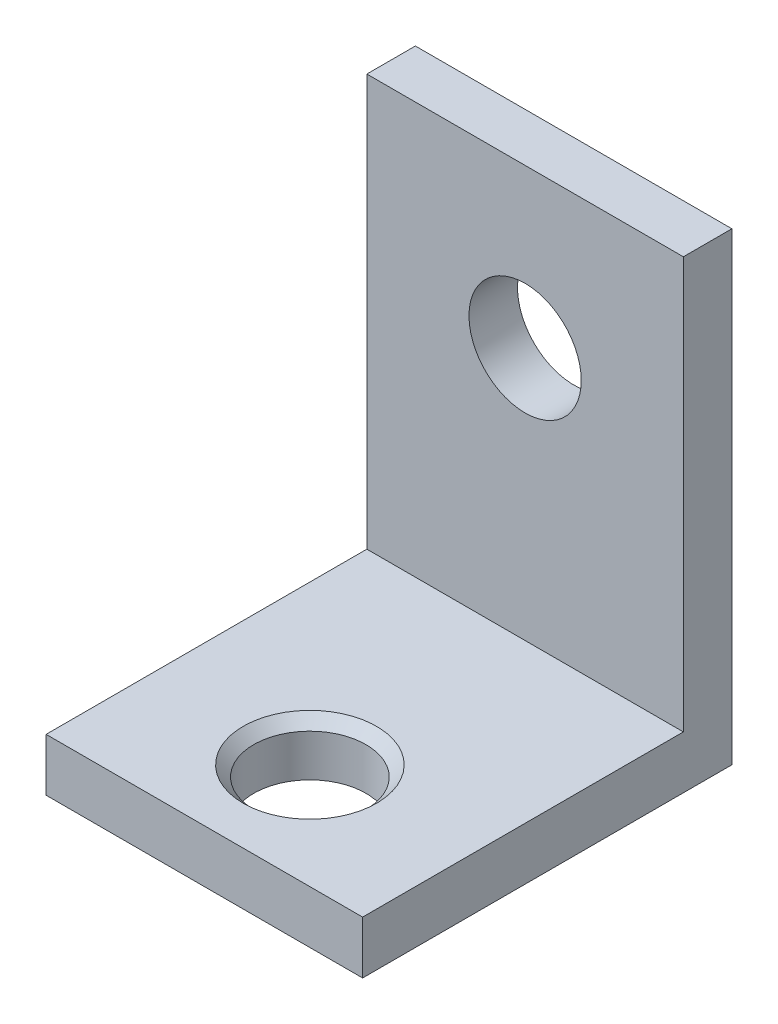
ISO-10303-21;
HEADER;
FILE_DESCRIPTION(('STEP AP214'),'2;1');
FILE_NAME('part.step','',(''),(''),'','','');
FILE_SCHEMA(('AUTOMOTIVE_DESIGN { 1 0 10303 214 1 1 1 1 }'));
ENDSEC;
DATA;
#1=APPLICATION_CONTEXT('core data for automotive mechanical design processes');
#2=APPLICATION_PROTOCOL_DEFINITION('international standard','automotive_design',2000,#1);
#3=PRODUCT_CONTEXT('',#1,'mechanical');
#4=PRODUCT('Part','Part','',(#3));
#5=PRODUCT_RELATED_PRODUCT_CATEGORY('part','',(#4));
#6=PRODUCT_DEFINITION_FORMATION('','',#4);
#7=PRODUCT_DEFINITION_CONTEXT('part definition',#1,'design');
#8=PRODUCT_DEFINITION('design','',#6,#7);
#9=PRODUCT_DEFINITION_SHAPE('','',#8);
#10=(LENGTH_UNIT() NAMED_UNIT(*) SI_UNIT(.MILLI.,.METRE.));
#11=(NAMED_UNIT(*) PLANE_ANGLE_UNIT() SI_UNIT($,.RADIAN.));
#12=(NAMED_UNIT(*) SI_UNIT($,.STERADIAN.) SOLID_ANGLE_UNIT());
#13=UNCERTAINTY_MEASURE_WITH_UNIT(LENGTH_MEASURE(1.E-05),#10,'distance_accuracy_value','');
#14=(GEOMETRIC_REPRESENTATION_CONTEXT(3) GLOBAL_UNCERTAINTY_ASSIGNED_CONTEXT((#13)) GLOBAL_UNIT_ASSIGNED_CONTEXT((#10,
#11,#12)) REPRESENTATION_CONTEXT('',''));
#15=CARTESIAN_POINT('',(0.,0.,0.));
#16=DIRECTION('',(0.,0.,1.));
#17=DIRECTION('',(1.,0.,0.));
#18=AXIS2_PLACEMENT_3D('',#15,#16,#17);
#19=CARTESIAN_POINT('',(0.,3.175,0.));
#20=DIRECTION('',(0.,-1.,0.));
#21=DIRECTION('',(0.,0.,-1.));
#22=AXIS2_PLACEMENT_3D('',#19,#20,#21);
#23=PLANE('',#22);
#24=CARTESIAN_POINT('',(9.525,3.175,-6.35));
#25=DIRECTION('',(0.,1.,0.));
#26=DIRECTION('',(0.,0.,1.));
#27=AXIS2_PLACEMENT_3D('',#24,#25,#26);
#28=CIRCLE('',#27,4.0132);
#29=CARTESIAN_POINT('',(9.525,3.175,-2.3368));
#30=VERTEX_POINT('',#29);
#31=EDGE_CURVE('E241',#30,#30,#28,.T.);
#32=ORIENTED_EDGE('',*,*,#31,.F.);
#33=EDGE_LOOP('',(#32));
#34=FACE_BOUND('',#33,.T.);
#35=DIRECTION('',(1.,0.,0.));
#36=VECTOR('',#35,1.);
#37=CARTESIAN_POINT('',(0.,3.175,-19.304));
#38=LINE('',#37,#36);
#39=CARTESIAN_POINT('',(0.,3.175,-19.304));
#40=VERTEX_POINT('',#39);
#41=CARTESIAN_POINT('',(19.05,3.175,-19.304));
#42=VERTEX_POINT('',#41);
#43=EDGE_CURVE('E56',#40,#42,#38,.T.);
#44=ORIENTED_EDGE('',*,*,#43,.F.);
#45=DIRECTION('',(0.,0.,1.));
#46=VECTOR('',#45,1.);
#47=CARTESIAN_POINT('',(0.,3.175,0.));
#48=LINE('',#47,#46);
#49=CARTESIAN_POINT('',(0.,3.175,0.));
#50=VERTEX_POINT('',#49);
#51=EDGE_CURVE('E107',#40,#50,#48,.T.);
#52=ORIENTED_EDGE('',*,*,#51,.T.);
#53=DIRECTION('',(1.,0.,0.));
#54=VECTOR('',#53,1.);
#55=CARTESIAN_POINT('',(0.,3.175,0.));
#56=LINE('',#55,#54);
#57=CARTESIAN_POINT('',(19.05,3.175,0.));
#58=VERTEX_POINT('',#57);
#59=EDGE_CURVE('E145',#50,#58,#56,.T.);
#60=ORIENTED_EDGE('',*,*,#59,.T.);
#61=DIRECTION('',(0.,0.,-1.));
#62=VECTOR('',#61,1.);
#63=CARTESIAN_POINT('',(19.05,3.175,0.));
#64=LINE('',#63,#62);
#65=EDGE_CURVE('E117',#58,#42,#64,.T.);
#66=ORIENTED_EDGE('',*,*,#65,.T.);
#67=EDGE_LOOP('',(#44,#52,#60,#66));
#68=FACE_BOUND('',#67,.T.);
#69=ADVANCED_FACE('F37',(#34,#68),#23,.F.);
#70=CARTESIAN_POINT('',(0.,3.175,0.));
#71=DIRECTION('',(1.,0.,0.));
#72=DIRECTION('',(0.,0.,-1.));
#73=AXIS2_PLACEMENT_3D('',#70,#71,#72);
#74=PLANE('',#73);
#75=DIRECTION('',(0.,0.,1.));
#76=VECTOR('',#75,1.);
#77=CARTESIAN_POINT('',(0.,0.,0.));
#78=LINE('',#77,#76);
#79=CARTESIAN_POINT('',(0.,0.,-22.225));
#80=VERTEX_POINT('',#79);
#81=CARTESIAN_POINT('',(0.,0.,0.));
#82=VERTEX_POINT('',#81);
#83=EDGE_CURVE('E114',#80,#82,#78,.T.);
#84=ORIENTED_EDGE('',*,*,#83,.T.);
#85=DIRECTION('',(0.,-1.,0.));
#86=VECTOR('',#85,1.);
#87=CARTESIAN_POINT('',(0.,3.175,0.));
#88=LINE('',#87,#86);
#89=EDGE_CURVE('E12',#50,#82,#88,.T.);
#90=ORIENTED_EDGE('',*,*,#89,.F.);
#91=ORIENTED_EDGE('',*,*,#51,.F.);
#92=DIRECTION('',(0.,-1.,0.));
#93=VECTOR('',#92,1.);
#94=CARTESIAN_POINT('',(0.,27.94,-19.304));
#95=LINE('',#94,#93);
#96=CARTESIAN_POINT('',(0.,27.94,-19.304));
#97=VERTEX_POINT('',#96);
#98=EDGE_CURVE('E121',#97,#40,#95,.T.);
#99=ORIENTED_EDGE('',*,*,#98,.F.);
#100=DIRECTION('',(0.,0.,1.));
#101=VECTOR('',#100,1.);
#102=CARTESIAN_POINT('',(0.,27.94,-22.225));
#103=LINE('',#102,#101);
#104=CARTESIAN_POINT('',(0.,27.94,-22.225));
#105=VERTEX_POINT('',#104);
#106=EDGE_CURVE('E116',#105,#97,#103,.T.);
#107=ORIENTED_EDGE('',*,*,#106,.F.);
#108=DIRECTION('',(0.,-1.,0.));
#109=VECTOR('',#108,1.);
#110=CARTESIAN_POINT('',(0.,3.175,-22.225));
#111=LINE('',#110,#109);
#112=EDGE_CURVE('E103',#105,#80,#111,.T.);
#113=ORIENTED_EDGE('',*,*,#112,.T.);
#114=EDGE_LOOP('',(#84,#90,#91,#99,#107,#113));
#115=FACE_BOUND('',#114,.T.);
#116=ADVANCED_FACE('F112',(#115),#74,.F.);
#117=CARTESIAN_POINT('',(0.,3.175,0.));
#118=DIRECTION('',(0.,0.,-1.));
#119=DIRECTION('',(-1.,0.,0.));
#120=AXIS2_PLACEMENT_3D('',#117,#118,#119);
#121=PLANE('',#120);
#122=DIRECTION('',(1.,0.,0.));
#123=VECTOR('',#122,1.);
#124=CARTESIAN_POINT('',(0.,0.,0.));
#125=LINE('',#124,#123);
#126=CARTESIAN_POINT('',(19.05,0.,0.));
#127=VERTEX_POINT('',#126);
#128=EDGE_CURVE('E120',#82,#127,#125,.T.);
#129=ORIENTED_EDGE('',*,*,#128,.T.);
#130=DIRECTION('',(0.,-1.,0.));
#131=VECTOR('',#130,1.);
#132=CARTESIAN_POINT('',(19.05,3.175,0.));
#133=LINE('',#132,#131);
#134=EDGE_CURVE('E47',#58,#127,#133,.T.);
#135=ORIENTED_EDGE('',*,*,#134,.F.);
#136=ORIENTED_EDGE('',*,*,#59,.F.);
#137=ORIENTED_EDGE('',*,*,#89,.T.);
#138=EDGE_LOOP('',(#129,#135,#136,#137));
#139=FACE_BOUND('',#138,.T.);
#140=ADVANCED_FACE('F170',(#139),#121,.F.);
#141=CARTESIAN_POINT('',(19.05,3.175,0.));
#142=DIRECTION('',(-1.,0.,0.));
#143=DIRECTION('',(0.,0.,1.));
#144=AXIS2_PLACEMENT_3D('',#141,#142,#143);
#145=PLANE('',#144);
#146=DIRECTION('',(0.,0.,-1.));
#147=VECTOR('',#146,1.);
#148=CARTESIAN_POINT('',(19.05,0.,0.));
#149=LINE('',#148,#147);
#150=CARTESIAN_POINT('',(19.05,0.,-22.225));
#151=VERTEX_POINT('',#150);
#152=EDGE_CURVE('E95',#127,#151,#149,.T.);
#153=ORIENTED_EDGE('',*,*,#152,.T.);
#154=DIRECTION('',(0.,-1.,0.));
#155=VECTOR('',#154,1.);
#156=CARTESIAN_POINT('',(19.05,3.175,-22.225));
#157=LINE('',#156,#155);
#158=CARTESIAN_POINT('',(19.05,27.94,-22.225));
#159=VERTEX_POINT('',#158);
#160=EDGE_CURVE('E82',#159,#151,#157,.T.);
#161=ORIENTED_EDGE('',*,*,#160,.F.);
#162=DIRECTION('',(0.,0.,-1.));
#163=VECTOR('',#162,1.);
#164=CARTESIAN_POINT('',(19.05,27.94,-22.225));
#165=LINE('',#164,#163);
#166=CARTESIAN_POINT('',(19.05,27.94,-19.304));
#167=VERTEX_POINT('',#166);
#168=EDGE_CURVE('E137',#167,#159,#165,.T.);
#169=ORIENTED_EDGE('',*,*,#168,.F.);
#170=DIRECTION('',(0.,-1.,0.));
#171=VECTOR('',#170,1.);
#172=CARTESIAN_POINT('',(19.05,3.175,-19.304));
#173=LINE('',#172,#171);
#174=EDGE_CURVE('E41',#167,#42,#173,.T.);
#175=ORIENTED_EDGE('',*,*,#174,.T.);
#176=ORIENTED_EDGE('',*,*,#65,.F.);
#177=ORIENTED_EDGE('',*,*,#134,.T.);
#178=EDGE_LOOP('',(#153,#161,#169,#175,#176,#177));
#179=FACE_BOUND('',#178,.T.);
#180=ADVANCED_FACE('F151',(#179),#145,.F.);
#181=CARTESIAN_POINT('',(0.,3.175,-22.225));
#182=DIRECTION('',(0.,0.,1.));
#183=DIRECTION('',(1.,0.,0.));
#184=AXIS2_PLACEMENT_3D('',#181,#182,#183);
#185=PLANE('',#184);
#186=CARTESIAN_POINT('',(9.525,18.415,-22.225));
#187=DIRECTION('',(0.,0.,1.));
#188=DIRECTION('',(1.,0.,0.));
#189=AXIS2_PLACEMENT_3D('',#186,#187,#188);
#190=CIRCLE('',#189,3.37819999999999);
#191=CARTESIAN_POINT('',(12.9032,18.415,-22.225));
#192=VERTEX_POINT('',#191);
#193=EDGE_CURVE('E135',#192,#192,#190,.T.);
#194=ORIENTED_EDGE('',*,*,#193,.T.);
#195=EDGE_LOOP('',(#194));
#196=FACE_BOUND('',#195,.T.);
#197=DIRECTION('',(-1.,0.,0.));
#198=VECTOR('',#197,1.);
#199=CARTESIAN_POINT('',(0.,0.,-22.225));
#200=LINE('',#199,#198);
#201=EDGE_CURVE('E99',#151,#80,#200,.T.);
#202=ORIENTED_EDGE('',*,*,#201,.T.);
#203=ORIENTED_EDGE('',*,*,#112,.F.);
#204=DIRECTION('',(-1.,0.,0.));
#205=VECTOR('',#204,1.);
#206=CARTESIAN_POINT('',(0.,27.94,-22.225));
#207=LINE('',#206,#205);
#208=EDGE_CURVE('E138',#159,#105,#207,.T.);
#209=ORIENTED_EDGE('',*,*,#208,.F.);
#210=ORIENTED_EDGE('',*,*,#160,.T.);
#211=EDGE_LOOP('',(#202,#203,#209,#210));
#212=FACE_BOUND('',#211,.T.);
#213=ADVANCED_FACE('F101',(#196,#212),#185,.F.);
#214=CARTESIAN_POINT('',(0.,0.,0.));
#215=DIRECTION('',(0.,-1.,0.));
#216=DIRECTION('',(0.,0.,-1.));
#217=AXIS2_PLACEMENT_3D('',#214,#215,#216);
#218=PLANE('',#217);
#219=CARTESIAN_POINT('',(9.525,0.,-6.35));
#220=DIRECTION('',(0.,1.,0.));
#221=DIRECTION('',(0.,0.,1.));
#222=AXIS2_PLACEMENT_3D('',#219,#220,#221);
#223=CIRCLE('',#222,3.37819999999999);
#224=CARTESIAN_POINT('',(9.525,0.,-2.97180000000001));
#225=VERTEX_POINT('',#224);
#226=EDGE_CURVE('E136',#225,#225,#223,.T.);
#227=ORIENTED_EDGE('',*,*,#226,.T.);
#228=EDGE_LOOP('',(#227));
#229=FACE_BOUND('',#228,.T.);
#230=ORIENTED_EDGE('',*,*,#83,.F.);
#231=ORIENTED_EDGE('',*,*,#201,.F.);
#232=ORIENTED_EDGE('',*,*,#152,.F.);
#233=ORIENTED_EDGE('',*,*,#128,.F.);
#234=EDGE_LOOP('',(#230,#231,#232,#233));
#235=FACE_BOUND('',#234,.T.);
#236=ADVANCED_FACE('F119',(#229,#235),#218,.T.);
#237=CARTESIAN_POINT('',(0.,27.94,-19.304));
#238=DIRECTION('',(0.,0.,-1.));
#239=DIRECTION('',(-1.,0.,0.));
#240=AXIS2_PLACEMENT_3D('',#237,#238,#239);
#241=PLANE('',#240);
#242=CARTESIAN_POINT('',(9.525,18.415,-19.304));
#243=DIRECTION('',(0.,0.,-1.));
#244=DIRECTION('',(-1.,0.,0.));
#245=AXIS2_PLACEMENT_3D('',#242,#243,#244);
#246=CIRCLE('',#245,3.37819999999999);
#247=CARTESIAN_POINT('',(6.14680000000001,18.415,-19.304));
#248=VERTEX_POINT('',#247);
#249=EDGE_CURVE('E132',#248,#248,#246,.F.);
#250=ORIENTED_EDGE('',*,*,#249,.F.);
#251=EDGE_LOOP('',(#250));
#252=FACE_BOUND('',#251,.T.);
#253=ORIENTED_EDGE('',*,*,#43,.T.);
#254=ORIENTED_EDGE('',*,*,#174,.F.);
#255=DIRECTION('',(1.,0.,0.));
#256=VECTOR('',#255,1.);
#257=CARTESIAN_POINT('',(0.,27.94,-19.304));
#258=LINE('',#257,#256);
#259=EDGE_CURVE('E73',#97,#167,#258,.T.);
#260=ORIENTED_EDGE('',*,*,#259,.F.);
#261=ORIENTED_EDGE('',*,*,#98,.T.);
#262=EDGE_LOOP('',(#253,#254,#260,#261));
#263=FACE_BOUND('',#262,.T.);
#264=ADVANCED_FACE('F39',(#252,#263),#241,.F.);
#265=CARTESIAN_POINT('',(0.,27.94,0.));
#266=DIRECTION('',(0.,1.,0.));
#267=DIRECTION('',(0.,0.,1.));
#268=AXIS2_PLACEMENT_3D('',#265,#266,#267);
#269=PLANE('',#268);
#270=ORIENTED_EDGE('',*,*,#106,.T.);
#271=ORIENTED_EDGE('',*,*,#259,.T.);
#272=ORIENTED_EDGE('',*,*,#168,.T.);
#273=ORIENTED_EDGE('',*,*,#208,.T.);
#274=EDGE_LOOP('',(#270,#271,#272,#273));
#275=FACE_BOUND('',#274,.T.);
#276=ADVANCED_FACE('F152',(#275),#269,.T.);
#277=CARTESIAN_POINT('',(9.525,3.175,-6.35));
#278=DIRECTION('',(0.,1.,0.));
#279=DIRECTION('',(0.,0.,1.));
#280=AXIS2_PLACEMENT_3D('',#277,#278,#279);
#281=CYLINDRICAL_SURFACE('',#280,3.37819999999999);
#282=ORIENTED_EDGE('',*,*,#226,.F.);
#283=EDGE_LOOP('',(#282));
#284=FACE_BOUND('',#283,.T.);
#285=CARTESIAN_POINT('',(9.525,2.53999999999999,-6.35));
#286=DIRECTION('',(0.,1.,0.));
#287=DIRECTION('',(0.,0.,1.));
#288=AXIS2_PLACEMENT_3D('',#285,#286,#287);
#289=CIRCLE('',#288,3.37819999999999);
#290=CARTESIAN_POINT('',(9.525,2.53999999999999,-2.97180000000001));
#291=VERTEX_POINT('',#290);
#292=EDGE_CURVE('E239',#291,#291,#289,.T.);
#293=ORIENTED_EDGE('',*,*,#292,.T.);
#294=EDGE_LOOP('',(#293));
#295=FACE_BOUND('',#294,.T.);
#296=ADVANCED_FACE('F154',(#284,#295),#281,.F.);
#297=CARTESIAN_POINT('',(9.525,3.175,-6.35));
#298=DIRECTION('',(0.,1.,0.));
#299=DIRECTION('',(0.,0.,1.));
#300=AXIS2_PLACEMENT_3D('',#297,#298,#299);
#301=CONICAL_SURFACE('',#300,4.0132,0.785398163397448);
#302=ORIENTED_EDGE('',*,*,#292,.F.);
#303=EDGE_LOOP('',(#302));
#304=FACE_BOUND('',#303,.T.);
#305=ORIENTED_EDGE('',*,*,#31,.T.);
#306=EDGE_LOOP('',(#305));
#307=FACE_BOUND('',#306,.T.);
#308=ADVANCED_FACE('F160',(#304,#307),#301,.F.);
#309=CARTESIAN_POINT('',(9.525,18.415,-19.05));
#310=DIRECTION('',(0.,0.,1.));
#311=DIRECTION('',(1.,0.,0.));
#312=AXIS2_PLACEMENT_3D('',#309,#310,#311);
#313=CYLINDRICAL_SURFACE('',#312,3.37819999999999);
#314=ORIENTED_EDGE('',*,*,#193,.F.);
#315=EDGE_LOOP('',(#314));
#316=FACE_BOUND('',#315,.T.);
#317=ORIENTED_EDGE('',*,*,#249,.T.);
#318=EDGE_LOOP('',(#317));
#319=FACE_BOUND('',#318,.T.);
#320=ADVANCED_FACE('F215',(#316,#319),#313,.F.);
#321=CLOSED_SHELL('',(#69,#116,#140,#180,#213,#236,#264,#276,#296,#308,#320));
#322=MANIFOLD_SOLID_BREP('B2',#321);
#323=ADVANCED_BREP_SHAPE_REPRESENTATION('',(#18,#322),#14);
#324=SHAPE_DEFINITION_REPRESENTATION(#9,#323);
ENDSEC;
END-ISO-10303-21;
